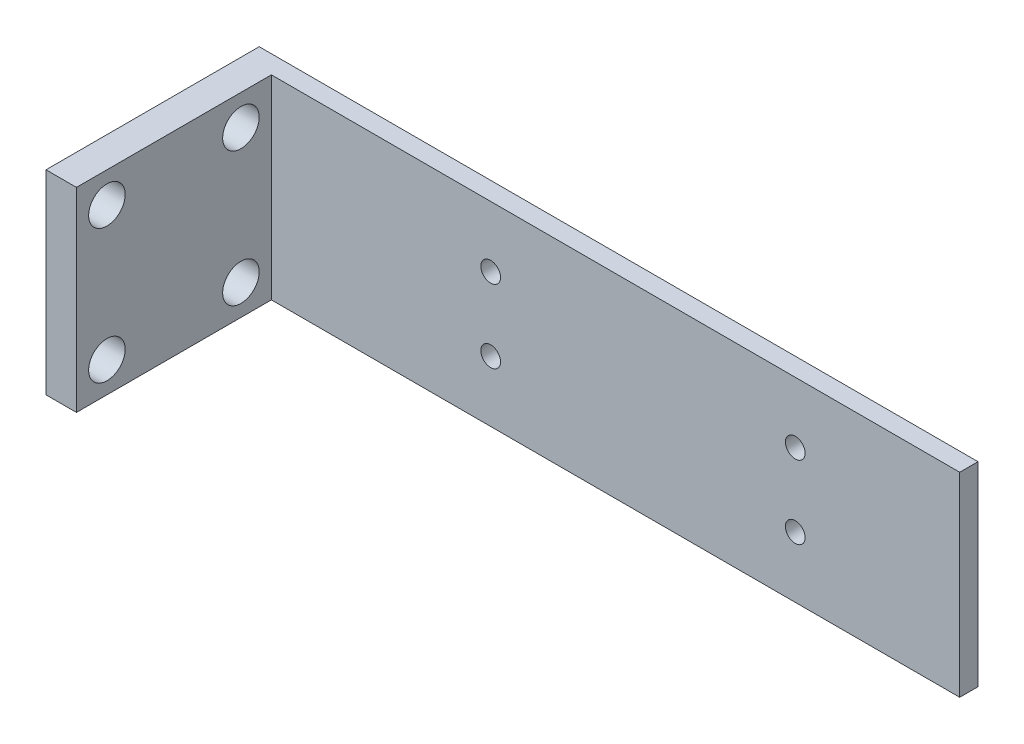
ISO-10303-21;
HEADER;
FILE_DESCRIPTION(('STEP AP214'),'2;1');
FILE_NAME('part.step','',(''),(''),'','','');
FILE_SCHEMA(('AUTOMOTIVE_DESIGN { 1 0 10303 214 1 1 1 1 }'));
ENDSEC;
DATA;
#1=APPLICATION_CONTEXT('core data for automotive mechanical design processes');
#2=APPLICATION_PROTOCOL_DEFINITION('international standard','automotive_design',2000,#1);
#3=PRODUCT_CONTEXT('',#1,'mechanical');
#4=PRODUCT('Part','Part','',(#3));
#5=PRODUCT_RELATED_PRODUCT_CATEGORY('part','',(#4));
#6=PRODUCT_DEFINITION_FORMATION('','',#4);
#7=PRODUCT_DEFINITION_CONTEXT('part definition',#1,'design');
#8=PRODUCT_DEFINITION('design','',#6,#7);
#9=PRODUCT_DEFINITION_SHAPE('','',#8);
#10=(LENGTH_UNIT() NAMED_UNIT(*) SI_UNIT(.MILLI.,.METRE.));
#11=(NAMED_UNIT(*) PLANE_ANGLE_UNIT() SI_UNIT($,.RADIAN.));
#12=(NAMED_UNIT(*) SI_UNIT($,.STERADIAN.) SOLID_ANGLE_UNIT());
#13=UNCERTAINTY_MEASURE_WITH_UNIT(LENGTH_MEASURE(1.E-05),#10,'distance_accuracy_value','');
#14=(GEOMETRIC_REPRESENTATION_CONTEXT(3) GLOBAL_UNCERTAINTY_ASSIGNED_CONTEXT((#13)) GLOBAL_UNIT_ASSIGNED_CONTEXT((#10,
#11,#12)) REPRESENTATION_CONTEXT('',''));
#15=CARTESIAN_POINT('',(0.,0.,0.));
#16=DIRECTION('',(0.,0.,1.));
#17=DIRECTION('',(1.,0.,0.));
#18=AXIS2_PLACEMENT_3D('',#15,#16,#17);
#19=CARTESIAN_POINT('',(-71.2816326530612,22.7170068027211,3.));
#20=DIRECTION('',(1.,0.,0.));
#21=DIRECTION('',(0.,0.,-1.));
#22=AXIS2_PLACEMENT_3D('',#19,#20,#21);
#23=PLANE('',#22);
#24=CARTESIAN_POINT('',(-71.2816326530612,-4.28299319727892,30.));
#25=DIRECTION('',(-1.,0.,0.));
#26=DIRECTION('',(0.,0.,1.));
#27=AXIS2_PLACEMENT_3D('',#24,#25,#26);
#28=CIRCLE('',#27,3.);
#29=CARTESIAN_POINT('',(-71.2816326530612,-4.28299319727892,33.));
#30=VERTEX_POINT('',#29);
#31=EDGE_CURVE('E194',#30,#30,#28,.T.);
#32=ORIENTED_EDGE('',*,*,#31,.F.);
#33=EDGE_LOOP('',(#32));
#34=FACE_BOUND('',#33,.T.);
#35=CARTESIAN_POINT('',(-71.2816326530612,17.7170068027211,8.));
#36=DIRECTION('',(-1.,0.,0.));
#37=DIRECTION('',(0.,0.,1.));
#38=AXIS2_PLACEMENT_3D('',#35,#36,#37);
#39=CIRCLE('',#38,3.);
#40=CARTESIAN_POINT('',(-71.2816326530612,17.7170068027211,11.));
#41=VERTEX_POINT('',#40);
#42=EDGE_CURVE('E195',#41,#41,#39,.T.);
#43=ORIENTED_EDGE('',*,*,#42,.F.);
#44=EDGE_LOOP('',(#43));
#45=FACE_BOUND('',#44,.T.);
#46=CARTESIAN_POINT('',(-71.2816326530612,-4.28299319727892,8.));
#47=DIRECTION('',(-1.,0.,0.));
#48=DIRECTION('',(0.,0.,1.));
#49=AXIS2_PLACEMENT_3D('',#46,#47,#48);
#50=CIRCLE('',#49,3.);
#51=CARTESIAN_POINT('',(-71.2816326530612,-4.28299319727892,11.));
#52=VERTEX_POINT('',#51);
#53=EDGE_CURVE('E198',#52,#52,#50,.T.);
#54=ORIENTED_EDGE('',*,*,#53,.F.);
#55=EDGE_LOOP('',(#54));
#56=FACE_BOUND('',#55,.T.);
#57=CARTESIAN_POINT('',(-71.2816326530612,17.7170068027211,30.));
#58=DIRECTION('',(-1.,0.,0.));
#59=DIRECTION('',(0.,0.,1.));
#60=AXIS2_PLACEMENT_3D('',#57,#58,#59);
#61=CIRCLE('',#60,3.);
#62=CARTESIAN_POINT('',(-71.2816326530612,17.7170068027211,33.));
#63=VERTEX_POINT('',#62);
#64=EDGE_CURVE('E125',#63,#63,#61,.T.);
#65=ORIENTED_EDGE('',*,*,#64,.F.);
#66=EDGE_LOOP('',(#65));
#67=FACE_BOUND('',#66,.T.);
#68=DIRECTION('',(0.,-1.,0.));
#69=VECTOR('',#68,1.);
#70=CARTESIAN_POINT('',(-71.2816326530612,22.7170068027211,0.));
#71=LINE('',#70,#69);
#72=CARTESIAN_POINT('',(-71.2816326530612,22.7170068027211,0.));
#73=VERTEX_POINT('',#72);
#74=CARTESIAN_POINT('',(-71.2816326530612,-9.28299319727892,0.));
#75=VERTEX_POINT('',#74);
#76=EDGE_CURVE('E101',#73,#75,#71,.T.);
#77=ORIENTED_EDGE('',*,*,#76,.T.);
#78=DIRECTION('',(0.,0.,-1.));
#79=VECTOR('',#78,1.);
#80=CARTESIAN_POINT('',(-71.2816326530612,-9.28299319727892,3.));
#81=LINE('',#80,#79);
#82=CARTESIAN_POINT('',(-71.2816326530612,-9.28299319727892,35.));
#83=VERTEX_POINT('',#82);
#84=EDGE_CURVE('E11',#83,#75,#81,.T.);
#85=ORIENTED_EDGE('',*,*,#84,.F.);
#86=DIRECTION('',(0.,-1.,0.));
#87=VECTOR('',#86,1.);
#88=CARTESIAN_POINT('',(-71.2816326530612,22.7170068027211,35.));
#89=LINE('',#88,#87);
#90=CARTESIAN_POINT('',(-71.2816326530612,22.7170068027211,35.));
#91=VERTEX_POINT('',#90);
#92=EDGE_CURVE('E103',#91,#83,#89,.T.);
#93=ORIENTED_EDGE('',*,*,#92,.F.);
#94=DIRECTION('',(0.,0.,-1.));
#95=VECTOR('',#94,1.);
#96=CARTESIAN_POINT('',(-71.2816326530612,22.7170068027211,3.));
#97=LINE('',#96,#95);
#98=EDGE_CURVE('E87',#91,#73,#97,.T.);
#99=ORIENTED_EDGE('',*,*,#98,.T.);
#100=EDGE_LOOP('',(#77,#85,#93,#99));
#101=FACE_BOUND('',#100,.T.);
#102=ADVANCED_FACE('F41',(#34,#45,#56,#67,#101),#23,.F.);
#103=CARTESIAN_POINT('',(-71.2816326530612,-9.28299319727892,3.));
#104=DIRECTION('',(0.,1.,0.));
#105=DIRECTION('',(0.,0.,1.));
#106=AXIS2_PLACEMENT_3D('',#103,#104,#105);
#107=PLANE('',#106);
#108=DIRECTION('',(1.,0.,0.));
#109=VECTOR('',#108,1.);
#110=CARTESIAN_POINT('',(-71.2816326530612,-9.28299319727892,0.));
#111=LINE('',#110,#109);
#112=CARTESIAN_POINT('',(46.7183673469388,-9.28299319727892,0.));
#113=VERTEX_POINT('',#112);
#114=EDGE_CURVE('E107',#75,#113,#111,.T.);
#115=ORIENTED_EDGE('',*,*,#114,.T.);
#116=DIRECTION('',(0.,0.,-1.));
#117=VECTOR('',#116,1.);
#118=CARTESIAN_POINT('',(46.7183673469388,-9.28299319727892,3.));
#119=LINE('',#118,#117);
#120=CARTESIAN_POINT('',(46.7183673469388,-9.28299319727892,3.));
#121=VERTEX_POINT('',#120);
#122=EDGE_CURVE('E49',#121,#113,#119,.T.);
#123=ORIENTED_EDGE('',*,*,#122,.F.);
#124=DIRECTION('',(1.,0.,0.));
#125=VECTOR('',#124,1.);
#126=CARTESIAN_POINT('',(-71.2816326530612,-9.28299319727892,3.));
#127=LINE('',#126,#125);
#128=CARTESIAN_POINT('',(-66.2816326530612,-9.28299319727892,3.));
#129=VERTEX_POINT('',#128);
#130=EDGE_CURVE('E94',#129,#121,#127,.T.);
#131=ORIENTED_EDGE('',*,*,#130,.F.);
#132=DIRECTION('',(0.,0.,-1.));
#133=VECTOR('',#132,1.);
#134=CARTESIAN_POINT('',(-66.2816326530612,-9.28299319727892,35.));
#135=LINE('',#134,#133);
#136=CARTESIAN_POINT('',(-66.2816326530612,-9.28299319727892,35.));
#137=VERTEX_POINT('',#136);
#138=EDGE_CURVE('E148',#137,#129,#135,.T.);
#139=ORIENTED_EDGE('',*,*,#138,.F.);
#140=DIRECTION('',(1.,0.,0.));
#141=VECTOR('',#140,1.);
#142=CARTESIAN_POINT('',(-71.2816326530612,-9.28299319727892,35.));
#143=LINE('',#142,#141);
#144=EDGE_CURVE('E140',#83,#137,#143,.T.);
#145=ORIENTED_EDGE('',*,*,#144,.F.);
#146=ORIENTED_EDGE('',*,*,#84,.T.);
#147=EDGE_LOOP('',(#115,#123,#131,#139,#145,#146));
#148=FACE_BOUND('',#147,.T.);
#149=ADVANCED_FACE('F188',(#148),#107,.F.);
#150=CARTESIAN_POINT('',(46.7183673469388,22.7170068027211,3.));
#151=DIRECTION('',(-1.,0.,0.));
#152=DIRECTION('',(0.,0.,1.));
#153=AXIS2_PLACEMENT_3D('',#150,#151,#152);
#154=PLANE('',#153);
#155=DIRECTION('',(0.,1.,0.));
#156=VECTOR('',#155,1.);
#157=CARTESIAN_POINT('',(46.7183673469388,22.7170068027211,0.));
#158=LINE('',#157,#156);
#159=CARTESIAN_POINT('',(46.7183673469388,22.7170068027211,0.));
#160=VERTEX_POINT('',#159);
#161=EDGE_CURVE('E95',#113,#160,#158,.T.);
#162=ORIENTED_EDGE('',*,*,#161,.T.);
#163=DIRECTION('',(0.,0.,-1.));
#164=VECTOR('',#163,1.);
#165=CARTESIAN_POINT('',(46.7183673469388,22.7170068027211,3.));
#166=LINE('',#165,#164);
#167=CARTESIAN_POINT('',(46.7183673469388,22.7170068027211,3.));
#168=VERTEX_POINT('',#167);
#169=EDGE_CURVE('E90',#168,#160,#166,.T.);
#170=ORIENTED_EDGE('',*,*,#169,.F.);
#171=DIRECTION('',(0.,1.,0.));
#172=VECTOR('',#171,1.);
#173=CARTESIAN_POINT('',(46.7183673469388,22.7170068027211,3.));
#174=LINE('',#173,#172);
#175=EDGE_CURVE('E63',#121,#168,#174,.T.);
#176=ORIENTED_EDGE('',*,*,#175,.F.);
#177=ORIENTED_EDGE('',*,*,#122,.T.);
#178=EDGE_LOOP('',(#162,#170,#176,#177));
#179=FACE_BOUND('',#178,.T.);
#180=ADVANCED_FACE('F248',(#179),#154,.F.);
#181=CARTESIAN_POINT('',(-71.2816326530612,22.7170068027211,3.));
#182=DIRECTION('',(0.,-1.,0.));
#183=DIRECTION('',(0.,0.,-1.));
#184=AXIS2_PLACEMENT_3D('',#181,#182,#183);
#185=PLANE('',#184);
#186=DIRECTION('',(-1.,0.,0.));
#187=VECTOR('',#186,1.);
#188=CARTESIAN_POINT('',(-71.2816326530612,22.7170068027211,0.));
#189=LINE('',#188,#187);
#190=EDGE_CURVE('E83',#160,#73,#189,.T.);
#191=ORIENTED_EDGE('',*,*,#190,.T.);
#192=ORIENTED_EDGE('',*,*,#98,.F.);
#193=DIRECTION('',(-1.,0.,0.));
#194=VECTOR('',#193,1.);
#195=CARTESIAN_POINT('',(-71.2816326530612,22.7170068027211,35.));
#196=LINE('',#195,#194);
#197=CARTESIAN_POINT('',(-66.2816326530612,22.7170068027211,35.));
#198=VERTEX_POINT('',#197);
#199=EDGE_CURVE('E144',#198,#91,#196,.T.);
#200=ORIENTED_EDGE('',*,*,#199,.F.);
#201=DIRECTION('',(0.,0.,-1.));
#202=VECTOR('',#201,1.);
#203=CARTESIAN_POINT('',(-66.2816326530612,22.7170068027211,35.));
#204=LINE('',#203,#202);
#205=CARTESIAN_POINT('',(-66.2816326530612,22.7170068027211,3.));
#206=VERTEX_POINT('',#205);
#207=EDGE_CURVE('E146',#198,#206,#204,.T.);
#208=ORIENTED_EDGE('',*,*,#207,.T.);
#209=DIRECTION('',(-1.,0.,0.));
#210=VECTOR('',#209,1.);
#211=CARTESIAN_POINT('',(-71.2816326530612,22.7170068027211,3.));
#212=LINE('',#211,#210);
#213=EDGE_CURVE('E104',#168,#206,#212,.T.);
#214=ORIENTED_EDGE('',*,*,#213,.F.);
#215=ORIENTED_EDGE('',*,*,#169,.T.);
#216=EDGE_LOOP('',(#191,#192,#200,#208,#214,#215));
#217=FACE_BOUND('',#216,.T.);
#218=ADVANCED_FACE('F85',(#217),#185,.F.);
#219=CARTESIAN_POINT('',(0.,0.,3.));
#220=DIRECTION('',(0.,0.,1.));
#221=DIRECTION('',(1.,0.,0.));
#222=AXIS2_PLACEMENT_3D('',#219,#220,#221);
#223=PLANE('',#222);
#224=DIRECTION('',(0.,1.,0.));
#225=VECTOR('',#224,1.);
#226=CARTESIAN_POINT('',(-66.2816326530612,22.7170068027211,3.));
#227=LINE('',#226,#225);
#228=EDGE_CURVE('E57',#129,#206,#227,.T.);
#229=ORIENTED_EDGE('',*,*,#228,.F.);
#230=ORIENTED_EDGE('',*,*,#130,.T.);
#231=ORIENTED_EDGE('',*,*,#175,.T.);
#232=ORIENTED_EDGE('',*,*,#213,.T.);
#233=EDGE_LOOP('',(#229,#230,#231,#232));
#234=FACE_BOUND('',#233,.T.);
#235=CARTESIAN_POINT('',(-30.2816326530612,0.717006802721081,3.));
#236=DIRECTION('',(0.,0.,1.));
#237=DIRECTION('',(1.,0.,0.));
#238=AXIS2_PLACEMENT_3D('',#235,#236,#237);
#239=CIRCLE('',#238,1.62);
#240=CARTESIAN_POINT('',(-28.6616326530612,0.717006802721081,3.));
#241=VERTEX_POINT('',#240);
#242=EDGE_CURVE('E157',#241,#241,#239,.T.);
#243=ORIENTED_EDGE('',*,*,#242,.F.);
#244=EDGE_LOOP('',(#243));
#245=FACE_BOUND('',#244,.T.);
#246=CARTESIAN_POINT('',(19.7183673469388,12.7170068027211,3.));
#247=DIRECTION('',(0.,0.,1.));
#248=DIRECTION('',(1.,0.,0.));
#249=AXIS2_PLACEMENT_3D('',#246,#247,#248);
#250=CIRCLE('',#249,1.62);
#251=CARTESIAN_POINT('',(21.3383673469388,12.7170068027211,3.));
#252=VERTEX_POINT('',#251);
#253=EDGE_CURVE('E163',#252,#252,#250,.T.);
#254=ORIENTED_EDGE('',*,*,#253,.F.);
#255=EDGE_LOOP('',(#254));
#256=FACE_BOUND('',#255,.T.);
#257=CARTESIAN_POINT('',(19.7183673469388,0.717006802721081,3.));
#258=DIRECTION('',(0.,0.,1.));
#259=DIRECTION('',(1.,0.,0.));
#260=AXIS2_PLACEMENT_3D('',#257,#258,#259);
#261=CIRCLE('',#260,1.62);
#262=CARTESIAN_POINT('',(21.3383673469388,0.717006802721081,3.));
#263=VERTEX_POINT('',#262);
#264=EDGE_CURVE('E151',#263,#263,#261,.T.);
#265=ORIENTED_EDGE('',*,*,#264,.F.);
#266=EDGE_LOOP('',(#265));
#267=FACE_BOUND('',#266,.T.);
#268=CARTESIAN_POINT('',(-30.2816326530612,12.7170068027211,3.));
#269=DIRECTION('',(0.,0.,1.));
#270=DIRECTION('',(1.,0.,0.));
#271=AXIS2_PLACEMENT_3D('',#268,#269,#270);
#272=CIRCLE('',#271,1.62000000000001);
#273=CARTESIAN_POINT('',(-28.6616326530612,12.7170068027211,3.));
#274=VERTEX_POINT('',#273);
#275=EDGE_CURVE('E112',#274,#274,#272,.T.);
#276=ORIENTED_EDGE('',*,*,#275,.F.);
#277=EDGE_LOOP('',(#276));
#278=FACE_BOUND('',#277,.T.);
#279=ADVANCED_FACE('F170',(#234,#245,#256,#267,#278),#223,.T.);
#280=CARTESIAN_POINT('',(0.,0.,0.));
#281=DIRECTION('',(0.,0.,1.));
#282=DIRECTION('',(1.,0.,0.));
#283=AXIS2_PLACEMENT_3D('',#280,#281,#282);
#284=PLANE('',#283);
#285=CARTESIAN_POINT('',(-30.2816326530612,0.717006802721081,0.));
#286=DIRECTION('',(0.,0.,1.));
#287=DIRECTION('',(1.,0.,0.));
#288=AXIS2_PLACEMENT_3D('',#285,#286,#287);
#289=CIRCLE('',#288,1.62);
#290=CARTESIAN_POINT('',(-28.6616326530612,0.717006802721081,0.));
#291=VERTEX_POINT('',#290);
#292=EDGE_CURVE('E160',#291,#291,#289,.T.);
#293=ORIENTED_EDGE('',*,*,#292,.T.);
#294=EDGE_LOOP('',(#293));
#295=FACE_BOUND('',#294,.T.);
#296=CARTESIAN_POINT('',(19.7183673469388,12.7170068027211,0.));
#297=DIRECTION('',(0.,0.,1.));
#298=DIRECTION('',(1.,0.,0.));
#299=AXIS2_PLACEMENT_3D('',#296,#297,#298);
#300=CIRCLE('',#299,1.62);
#301=CARTESIAN_POINT('',(21.3383673469388,12.7170068027211,0.));
#302=VERTEX_POINT('',#301);
#303=EDGE_CURVE('E154',#302,#302,#300,.T.);
#304=ORIENTED_EDGE('',*,*,#303,.T.);
#305=EDGE_LOOP('',(#304));
#306=FACE_BOUND('',#305,.T.);
#307=CARTESIAN_POINT('',(19.7183673469388,0.717006802721081,0.));
#308=DIRECTION('',(0.,0.,1.));
#309=DIRECTION('',(1.,0.,0.));
#310=AXIS2_PLACEMENT_3D('',#307,#308,#309);
#311=CIRCLE('',#310,1.62);
#312=CARTESIAN_POINT('',(21.3383673469388,0.717006802721081,0.));
#313=VERTEX_POINT('',#312);
#314=EDGE_CURVE('E150',#313,#313,#311,.T.);
#315=ORIENTED_EDGE('',*,*,#314,.T.);
#316=EDGE_LOOP('',(#315));
#317=FACE_BOUND('',#316,.T.);
#318=CARTESIAN_POINT('',(-30.2816326530612,12.7170068027211,0.));
#319=DIRECTION('',(0.,0.,1.));
#320=DIRECTION('',(1.,0.,0.));
#321=AXIS2_PLACEMENT_3D('',#318,#319,#320);
#322=CIRCLE('',#321,1.62000000000001);
#323=CARTESIAN_POINT('',(-28.6616326530612,12.7170068027211,0.));
#324=VERTEX_POINT('',#323);
#325=EDGE_CURVE('E108',#324,#324,#322,.T.);
#326=ORIENTED_EDGE('',*,*,#325,.T.);
#327=EDGE_LOOP('',(#326));
#328=FACE_BOUND('',#327,.T.);
#329=ORIENTED_EDGE('',*,*,#76,.F.);
#330=ORIENTED_EDGE('',*,*,#190,.F.);
#331=ORIENTED_EDGE('',*,*,#161,.F.);
#332=ORIENTED_EDGE('',*,*,#114,.F.);
#333=EDGE_LOOP('',(#329,#330,#331,#332));
#334=FACE_BOUND('',#333,.T.);
#335=ADVANCED_FACE('F106',(#295,#306,#317,#328,#334),#284,.F.);
#336=CARTESIAN_POINT('',(-30.2816326530612,12.7170068027211,0.));
#337=DIRECTION('',(0.,0.,1.));
#338=DIRECTION('',(1.,0.,0.));
#339=AXIS2_PLACEMENT_3D('',#336,#337,#338);
#340=CYLINDRICAL_SURFACE('',#339,1.62000000000001);
#341=ORIENTED_EDGE('',*,*,#325,.F.);
#342=EDGE_LOOP('',(#341));
#343=FACE_BOUND('',#342,.T.);
#344=ORIENTED_EDGE('',*,*,#275,.T.);
#345=EDGE_LOOP('',(#344));
#346=FACE_BOUND('',#345,.T.);
#347=ADVANCED_FACE('F232',(#343,#346),#340,.F.);
#348=CARTESIAN_POINT('',(19.7183673469388,0.717006802721081,0.));
#349=DIRECTION('',(0.,0.,1.));
#350=DIRECTION('',(1.,0.,0.));
#351=AXIS2_PLACEMENT_3D('',#348,#349,#350);
#352=CYLINDRICAL_SURFACE('',#351,1.62);
#353=ORIENTED_EDGE('',*,*,#314,.F.);
#354=EDGE_LOOP('',(#353));
#355=FACE_BOUND('',#354,.T.);
#356=ORIENTED_EDGE('',*,*,#264,.T.);
#357=EDGE_LOOP('',(#356));
#358=FACE_BOUND('',#357,.T.);
#359=ADVANCED_FACE('F230',(#355,#358),#352,.F.);
#360=CARTESIAN_POINT('',(19.7183673469388,12.7170068027211,0.));
#361=DIRECTION('',(0.,0.,1.));
#362=DIRECTION('',(1.,0.,0.));
#363=AXIS2_PLACEMENT_3D('',#360,#361,#362);
#364=CYLINDRICAL_SURFACE('',#363,1.62);
#365=ORIENTED_EDGE('',*,*,#303,.F.);
#366=EDGE_LOOP('',(#365));
#367=FACE_BOUND('',#366,.T.);
#368=ORIENTED_EDGE('',*,*,#253,.T.);
#369=EDGE_LOOP('',(#368));
#370=FACE_BOUND('',#369,.T.);
#371=ADVANCED_FACE('F226',(#367,#370),#364,.F.);
#372=CARTESIAN_POINT('',(-30.2816326530612,0.717006802721081,0.));
#373=DIRECTION('',(0.,0.,1.));
#374=DIRECTION('',(1.,0.,0.));
#375=AXIS2_PLACEMENT_3D('',#372,#373,#374);
#376=CYLINDRICAL_SURFACE('',#375,1.62);
#377=ORIENTED_EDGE('',*,*,#292,.F.);
#378=EDGE_LOOP('',(#377));
#379=FACE_BOUND('',#378,.T.);
#380=ORIENTED_EDGE('',*,*,#242,.T.);
#381=EDGE_LOOP('',(#380));
#382=FACE_BOUND('',#381,.T.);
#383=ADVANCED_FACE('F219',(#379,#382),#376,.F.);
#384=CARTESIAN_POINT('',(-66.2816326530612,22.7170068027211,35.));
#385=DIRECTION('',(-1.,0.,0.));
#386=DIRECTION('',(0.,0.,1.));
#387=AXIS2_PLACEMENT_3D('',#384,#385,#386);
#388=PLANE('',#387);
#389=CARTESIAN_POINT('',(-66.2816326530612,-4.28299319727892,30.));
#390=DIRECTION('',(-1.,0.,0.));
#391=DIRECTION('',(0.,0.,1.));
#392=AXIS2_PLACEMENT_3D('',#389,#390,#391);
#393=CIRCLE('',#392,3.);
#394=CARTESIAN_POINT('',(-66.2816326530612,-4.28299319727892,33.));
#395=VERTEX_POINT('',#394);
#396=EDGE_CURVE('E44',#395,#395,#393,.T.);
#397=ORIENTED_EDGE('',*,*,#396,.T.);
#398=EDGE_LOOP('',(#397));
#399=FACE_BOUND('',#398,.T.);
#400=CARTESIAN_POINT('',(-66.2816326530612,17.7170068027211,8.));
#401=DIRECTION('',(-1.,0.,0.));
#402=DIRECTION('',(0.,0.,1.));
#403=AXIS2_PLACEMENT_3D('',#400,#401,#402);
#404=CIRCLE('',#403,3.);
#405=CARTESIAN_POINT('',(-66.2816326530612,17.7170068027211,11.));
#406=VERTEX_POINT('',#405);
#407=EDGE_CURVE('E127',#406,#406,#404,.T.);
#408=ORIENTED_EDGE('',*,*,#407,.T.);
#409=EDGE_LOOP('',(#408));
#410=FACE_BOUND('',#409,.T.);
#411=CARTESIAN_POINT('',(-66.2816326530612,-4.28299319727892,8.));
#412=DIRECTION('',(-1.,0.,0.));
#413=DIRECTION('',(0.,0.,1.));
#414=AXIS2_PLACEMENT_3D('',#411,#412,#413);
#415=CIRCLE('',#414,3.);
#416=CARTESIAN_POINT('',(-66.2816326530612,-4.28299319727892,11.));
#417=VERTEX_POINT('',#416);
#418=EDGE_CURVE('E124',#417,#417,#415,.T.);
#419=ORIENTED_EDGE('',*,*,#418,.T.);
#420=EDGE_LOOP('',(#419));
#421=FACE_BOUND('',#420,.T.);
#422=CARTESIAN_POINT('',(-66.2816326530612,17.7170068027211,30.));
#423=DIRECTION('',(-1.,0.,0.));
#424=DIRECTION('',(0.,0.,1.));
#425=AXIS2_PLACEMENT_3D('',#422,#423,#424);
#426=CIRCLE('',#425,3.);
#427=CARTESIAN_POINT('',(-66.2816326530612,17.7170068027211,33.));
#428=VERTEX_POINT('',#427);
#429=EDGE_CURVE('E121',#428,#428,#426,.T.);
#430=ORIENTED_EDGE('',*,*,#429,.T.);
#431=EDGE_LOOP('',(#430));
#432=FACE_BOUND('',#431,.T.);
#433=ORIENTED_EDGE('',*,*,#228,.T.);
#434=ORIENTED_EDGE('',*,*,#207,.F.);
#435=DIRECTION('',(0.,1.,0.));
#436=VECTOR('',#435,1.);
#437=CARTESIAN_POINT('',(-66.2816326530612,22.7170068027211,35.));
#438=LINE('',#437,#436);
#439=EDGE_CURVE('E178',#137,#198,#438,.T.);
#440=ORIENTED_EDGE('',*,*,#439,.F.);
#441=ORIENTED_EDGE('',*,*,#138,.T.);
#442=EDGE_LOOP('',(#433,#434,#440,#441));
#443=FACE_BOUND('',#442,.T.);
#444=ADVANCED_FACE('F175',(#399,#410,#421,#432,#443),#388,.F.);
#445=CARTESIAN_POINT('',(0.,0.,35.));
#446=DIRECTION('',(0.,0.,1.));
#447=DIRECTION('',(1.,0.,0.));
#448=AXIS2_PLACEMENT_3D('',#445,#446,#447);
#449=PLANE('',#448);
#450=ORIENTED_EDGE('',*,*,#92,.T.);
#451=ORIENTED_EDGE('',*,*,#144,.T.);
#452=ORIENTED_EDGE('',*,*,#439,.T.);
#453=ORIENTED_EDGE('',*,*,#199,.T.);
#454=EDGE_LOOP('',(#450,#451,#452,#453));
#455=FACE_BOUND('',#454,.T.);
#456=ADVANCED_FACE('F190',(#455),#449,.T.);
#457=CARTESIAN_POINT('',(-39.2816326530612,17.7170068027211,30.));
#458=DIRECTION('',(-1.,0.,0.));
#459=DIRECTION('',(0.,0.,1.));
#460=AXIS2_PLACEMENT_3D('',#457,#458,#459);
#461=CYLINDRICAL_SURFACE('',#460,3.);
#462=ORIENTED_EDGE('',*,*,#64,.T.);
#463=EDGE_LOOP('',(#462));
#464=FACE_BOUND('',#463,.T.);
#465=ORIENTED_EDGE('',*,*,#429,.F.);
#466=EDGE_LOOP('',(#465));
#467=FACE_BOUND('',#466,.T.);
#468=ADVANCED_FACE('F212',(#464,#467),#461,.F.);
#469=CARTESIAN_POINT('',(-39.2816326530612,-4.28299319727892,8.));
#470=DIRECTION('',(-1.,0.,0.));
#471=DIRECTION('',(0.,0.,1.));
#472=AXIS2_PLACEMENT_3D('',#469,#470,#471);
#473=CYLINDRICAL_SURFACE('',#472,3.);
#474=ORIENTED_EDGE('',*,*,#53,.T.);
#475=EDGE_LOOP('',(#474));
#476=FACE_BOUND('',#475,.T.);
#477=ORIENTED_EDGE('',*,*,#418,.F.);
#478=EDGE_LOOP('',(#477));
#479=FACE_BOUND('',#478,.T.);
#480=ADVANCED_FACE('F204',(#476,#479),#473,.F.);
#481=CARTESIAN_POINT('',(-39.2816326530612,17.7170068027211,8.));
#482=DIRECTION('',(-1.,0.,0.));
#483=DIRECTION('',(0.,0.,1.));
#484=AXIS2_PLACEMENT_3D('',#481,#482,#483);
#485=CYLINDRICAL_SURFACE('',#484,3.);
#486=ORIENTED_EDGE('',*,*,#42,.T.);
#487=EDGE_LOOP('',(#486));
#488=FACE_BOUND('',#487,.T.);
#489=ORIENTED_EDGE('',*,*,#407,.F.);
#490=EDGE_LOOP('',(#489));
#491=FACE_BOUND('',#490,.T.);
#492=ADVANCED_FACE('F341',(#488,#491),#485,.F.);
#493=CARTESIAN_POINT('',(-39.2816326530612,-4.28299319727892,30.));
#494=DIRECTION('',(-1.,0.,0.));
#495=DIRECTION('',(0.,0.,1.));
#496=AXIS2_PLACEMENT_3D('',#493,#494,#495);
#497=CYLINDRICAL_SURFACE('',#496,3.);
#498=ORIENTED_EDGE('',*,*,#31,.T.);
#499=EDGE_LOOP('',(#498));
#500=FACE_BOUND('',#499,.T.);
#501=ORIENTED_EDGE('',*,*,#396,.F.);
#502=EDGE_LOOP('',(#501));
#503=FACE_BOUND('',#502,.T.);
#504=ADVANCED_FACE('F349',(#500,#503),#497,.F.);
#505=CLOSED_SHELL('',(#102,#149,#180,#218,#279,#335,#347,#359,#371,#383,#444,#456,#468,#480,
#492,#504));
#506=MANIFOLD_SOLID_BREP('B2',#505);
#507=ADVANCED_BREP_SHAPE_REPRESENTATION('',(#18,#506),#14);
#508=SHAPE_DEFINITION_REPRESENTATION(#9,#507);
ENDSEC;
END-ISO-10303-21;
